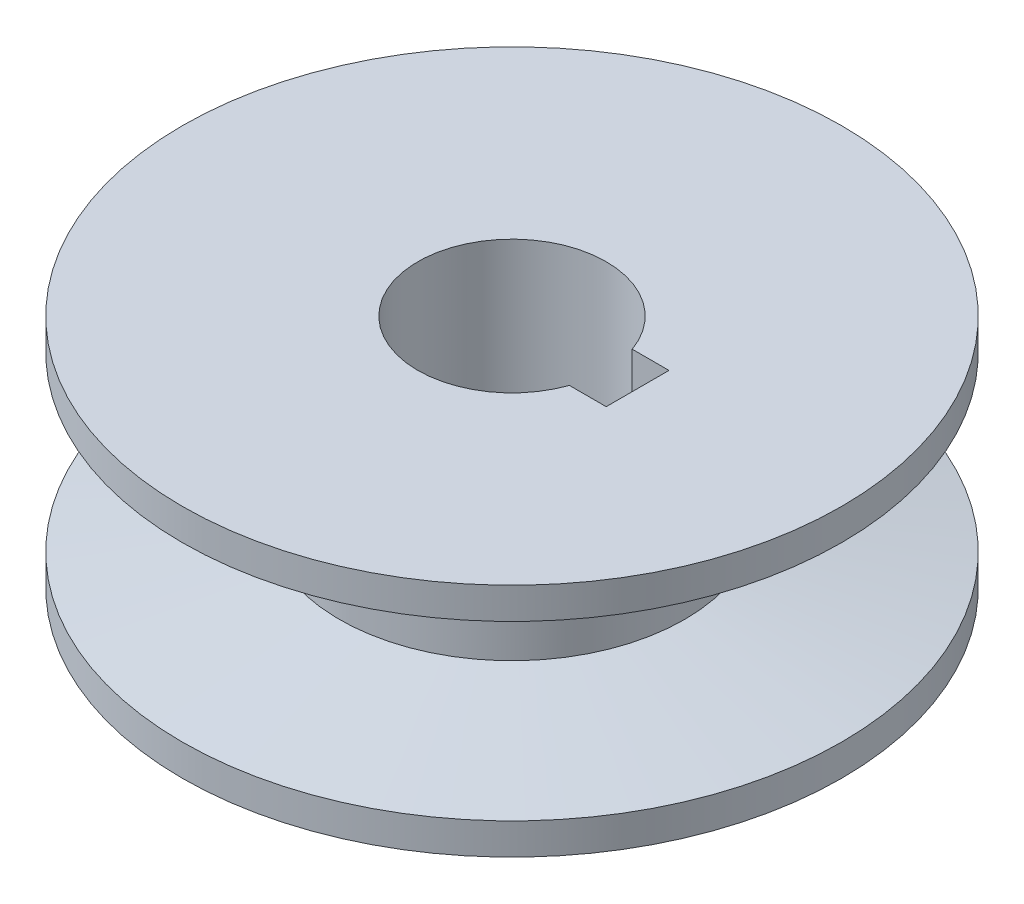
ISO-10303-21;
HEADER;
FILE_DESCRIPTION(('STEP AP214'),'2;1');
FILE_NAME('part.step','',(''),(''),'','','');
FILE_SCHEMA(('AUTOMOTIVE_DESIGN { 1 0 10303 214 1 1 1 1 }'));
ENDSEC;
DATA;
#1=APPLICATION_CONTEXT('core data for automotive mechanical design processes');
#2=APPLICATION_PROTOCOL_DEFINITION('international standard','automotive_design',2000,#1);
#3=PRODUCT_CONTEXT('',#1,'mechanical');
#4=PRODUCT('Part','Part','',(#3));
#5=PRODUCT_RELATED_PRODUCT_CATEGORY('part','',(#4));
#6=PRODUCT_DEFINITION_FORMATION('','',#4);
#7=PRODUCT_DEFINITION_CONTEXT('part definition',#1,'design');
#8=PRODUCT_DEFINITION('design','',#6,#7);
#9=PRODUCT_DEFINITION_SHAPE('','',#8);
#10=(LENGTH_UNIT() NAMED_UNIT(*) SI_UNIT(.MILLI.,.METRE.));
#11=(NAMED_UNIT(*) PLANE_ANGLE_UNIT() SI_UNIT($,.RADIAN.));
#12=(NAMED_UNIT(*) SI_UNIT($,.STERADIAN.) SOLID_ANGLE_UNIT());
#13=UNCERTAINTY_MEASURE_WITH_UNIT(LENGTH_MEASURE(1.E-05),#10,'distance_accuracy_value','');
#14=(GEOMETRIC_REPRESENTATION_CONTEXT(3) GLOBAL_UNCERTAINTY_ASSIGNED_CONTEXT((#13)) GLOBAL_UNIT_ASSIGNED_CONTEXT((#10,
#11,#12)) REPRESENTATION_CONTEXT('',''));
#15=CARTESIAN_POINT('',(0.,0.,0.));
#16=DIRECTION('',(0.,0.,1.));
#17=DIRECTION('',(1.,0.,0.));
#18=AXIS2_PLACEMENT_3D('',#15,#16,#17);
#19=CARTESIAN_POINT('',(0.,-1000.35675456204,0.));
#20=DIRECTION('',(0.,-1.,0.));
#21=DIRECTION('',(1.,0.,0.));
#22=AXIS2_PLACEMENT_3D('',#19,#20,#21);
#23=CYLINDRICAL_SURFACE('',#22,6.00000000000018);
#24=DIRECTION('',(0.,-1.,0.));
#25=VECTOR('',#24,1.);
#26=CARTESIAN_POINT('',(5.65685424949258,-1000.35675456204,-2.));
#27=LINE('',#26,#25);
#28=CARTESIAN_POINT('',(5.65685424949239,7.5,-2.));
#29=VERTEX_POINT('',#28);
#30=CARTESIAN_POINT('',(5.65685424949239,-7.5,-2.));
#31=VERTEX_POINT('',#30);
#32=EDGE_CURVE('E118',#29,#31,#27,.T.);
#33=ORIENTED_EDGE('',*,*,#32,.F.);
#34=CARTESIAN_POINT('',(-1.8515006871146E-13,7.50000000000006,0.));
#35=DIRECTION('',(0.,-1.,0.));
#36=DIRECTION('',(1.,0.,0.));
#37=AXIS2_PLACEMENT_3D('',#34,#35,#36);
#38=CIRCLE('',#37,6.00000000000018);
#39=CARTESIAN_POINT('',(5.65685424949239,7.5,2.));
#40=VERTEX_POINT('',#39);
#41=EDGE_CURVE('E49',#40,#29,#38,.T.);
#42=ORIENTED_EDGE('',*,*,#41,.F.);
#43=DIRECTION('',(0.,-1.,0.));
#44=VECTOR('',#43,1.);
#45=CARTESIAN_POINT('',(5.65685424949258,-1000.35675456204,2.));
#46=LINE('',#45,#44);
#47=CARTESIAN_POINT('',(5.65685424949239,-7.5,2.));
#48=VERTEX_POINT('',#47);
#49=EDGE_CURVE('E87',#48,#40,#46,.F.);
#50=ORIENTED_EDGE('',*,*,#49,.F.);
#51=CARTESIAN_POINT('',(-1.82394467761126E-13,-7.49999999999995,0.));
#52=DIRECTION('',(0.,-1.,0.));
#53=DIRECTION('',(1.,0.,0.));
#54=AXIS2_PLACEMENT_3D('',#51,#52,#53);
#55=CIRCLE('',#54,6.00000000000018);
#56=EDGE_CURVE('E121',#48,#31,#55,.T.);
#57=ORIENTED_EDGE('',*,*,#56,.T.);
#58=EDGE_LOOP('',(#33,#42,#50,#57));
#59=FACE_BOUND('',#58,.T.);
#60=ADVANCED_FACE('F41',(#59),#23,.F.);
#61=CARTESIAN_POINT('',(6.,7.5,0.));
#62=DIRECTION('',(0.,1.,0.));
#63=DIRECTION('',(-1.,0.,0.));
#64=AXIS2_PLACEMENT_3D('',#61,#62,#63);
#65=PLANE('',#64);
#66=DIRECTION('',(-1.,0.,0.));
#67=VECTOR('',#66,1.);
#68=CARTESIAN_POINT('',(8.,7.5,-2.));
#69=LINE('',#68,#67);
#70=CARTESIAN_POINT('',(8.,7.5,-2.));
#71=VERTEX_POINT('',#70);
#72=EDGE_CURVE('E63',#71,#29,#69,.T.);
#73=ORIENTED_EDGE('',*,*,#72,.F.);
#74=DIRECTION('',(0.,0.,-1.));
#75=VECTOR('',#74,1.);
#76=CARTESIAN_POINT('',(8.,7.5,-2.));
#77=LINE('',#76,#75);
#78=CARTESIAN_POINT('',(8.,7.5,2.));
#79=VERTEX_POINT('',#78);
#80=EDGE_CURVE('E96',#79,#71,#77,.T.);
#81=ORIENTED_EDGE('',*,*,#80,.F.);
#82=DIRECTION('',(1.,0.,0.));
#83=VECTOR('',#82,1.);
#84=CARTESIAN_POINT('',(8.,7.5,2.));
#85=LINE('',#84,#83);
#86=EDGE_CURVE('E81',#40,#79,#85,.T.);
#87=ORIENTED_EDGE('',*,*,#86,.F.);
#88=ORIENTED_EDGE('',*,*,#41,.T.);
#89=EDGE_LOOP('',(#73,#81,#87,#88));
#90=FACE_BOUND('',#89,.T.);
#91=CARTESIAN_POINT('',(-1.8515006871146E-13,7.50000000000006,0.));
#92=DIRECTION('',(0.,-1.,0.));
#93=DIRECTION('',(1.,0.,0.));
#94=AXIS2_PLACEMENT_3D('',#91,#92,#93);
#95=CIRCLE('',#94,21.0000000000002);
#96=CARTESIAN_POINT('',(21.,7.50000000000007,0.));
#97=VERTEX_POINT('',#96);
#98=EDGE_CURVE('E145',#97,#97,#95,.T.);
#99=ORIENTED_EDGE('',*,*,#98,.F.);
#100=EDGE_LOOP('',(#99));
#101=FACE_BOUND('',#100,.T.);
#102=ADVANCED_FACE('F101',(#90,#101),#65,.T.);
#103=CARTESIAN_POINT('',(0.,-1000.35675456204,0.));
#104=DIRECTION('',(0.,-1.,0.));
#105=DIRECTION('',(1.,0.,0.));
#106=AXIS2_PLACEMENT_3D('',#103,#104,#105);
#107=CYLINDRICAL_SURFACE('',#106,21.0000000000002);
#108=ORIENTED_EDGE('',*,*,#98,.T.);
#109=EDGE_LOOP('',(#108));
#110=FACE_BOUND('',#109,.T.);
#111=CARTESIAN_POINT('',(-1.84782655251416E-13,5.50000000000006,0.));
#112=DIRECTION('',(0.,-1.,0.));
#113=DIRECTION('',(1.,0.,0.));
#114=AXIS2_PLACEMENT_3D('',#111,#112,#113);
#115=CIRCLE('',#114,21.0000000000002);
#116=CARTESIAN_POINT('',(21.,5.50000000000006,0.));
#117=VERTEX_POINT('',#116);
#118=EDGE_CURVE('E141',#117,#117,#115,.T.);
#119=ORIENTED_EDGE('',*,*,#118,.F.);
#120=EDGE_LOOP('',(#119));
#121=FACE_BOUND('',#120,.T.);
#122=ADVANCED_FACE('F175',(#110,#121),#107,.T.);
#123=CARTESIAN_POINT('',(-1.84458730721009E-13,3.73673019291521,0.));
#124=DIRECTION('',(0.,1.,0.));
#125=DIRECTION('',(-1.,0.,0.));
#126=AXIS2_PLACEMENT_3D('',#123,#124,#125);
#127=CONICAL_SURFACE('',#126,11.0000000000002,1.39626340159544);
#128=ORIENTED_EDGE('',*,*,#118,.T.);
#129=EDGE_LOOP('',(#128));
#130=FACE_BOUND('',#129,.T.);
#131=CARTESIAN_POINT('',(-1.84458730721009E-13,3.73673019291521,0.));
#132=DIRECTION('',(0.,-1.,0.));
#133=DIRECTION('',(1.,0.,0.));
#134=AXIS2_PLACEMENT_3D('',#131,#132,#133);
#135=CIRCLE('',#134,11.0000000000002);
#136=CARTESIAN_POINT('',(11.,3.73673019291521,0.));
#137=VERTEX_POINT('',#136);
#138=EDGE_CURVE('E137',#137,#137,#135,.T.);
#139=ORIENTED_EDGE('',*,*,#138,.F.);
#140=EDGE_LOOP('',(#139));
#141=FACE_BOUND('',#140,.T.);
#142=ADVANCED_FACE('F179',(#130,#141),#127,.T.);
#143=CARTESIAN_POINT('',(0.,-1000.35675456204,0.));
#144=DIRECTION('',(0.,-1.,0.));
#145=DIRECTION('',(1.,0.,0.));
#146=AXIS2_PLACEMENT_3D('',#143,#144,#145);
#147=CYLINDRICAL_SURFACE('',#146,11.0000000000002);
#148=ORIENTED_EDGE('',*,*,#138,.T.);
#149=EDGE_LOOP('',(#148));
#150=FACE_BOUND('',#149,.T.);
#151=CARTESIAN_POINT('',(-1.83085805751577E-13,-3.73673019291532,0.));
#152=DIRECTION('',(0.,-1.,0.));
#153=DIRECTION('',(1.,0.,0.));
#154=AXIS2_PLACEMENT_3D('',#151,#152,#153);
#155=CIRCLE('',#154,11.0000000000002);
#156=CARTESIAN_POINT('',(11.,-3.73673019291531,0.));
#157=VERTEX_POINT('',#156);
#158=EDGE_CURVE('E133',#157,#157,#155,.T.);
#159=ORIENTED_EDGE('',*,*,#158,.F.);
#160=EDGE_LOOP('',(#159));
#161=FACE_BOUND('',#160,.T.);
#162=ADVANCED_FACE('F168',(#150,#161),#147,.T.);
#163=CARTESIAN_POINT('',(-1.8276188122117E-13,-5.49999999999995,0.));
#164=DIRECTION('',(0.,-1.,0.));
#165=DIRECTION('',(1.,0.,0.));
#166=AXIS2_PLACEMENT_3D('',#163,#164,#165);
#167=CONICAL_SURFACE('',#166,21.0000000000002,1.39626340159547);
#168=ORIENTED_EDGE('',*,*,#158,.T.);
#169=EDGE_LOOP('',(#168));
#170=FACE_BOUND('',#169,.T.);
#171=CARTESIAN_POINT('',(-1.8276188122117E-13,-5.49999999999995,0.));
#172=DIRECTION('',(0.,-1.,0.));
#173=DIRECTION('',(1.,0.,0.));
#174=AXIS2_PLACEMENT_3D('',#171,#172,#173);
#175=CIRCLE('',#174,21.0000000000002);
#176=CARTESIAN_POINT('',(21.,-5.49999999999995,0.));
#177=VERTEX_POINT('',#176);
#178=EDGE_CURVE('E129',#177,#177,#175,.T.);
#179=ORIENTED_EDGE('',*,*,#178,.F.);
#180=EDGE_LOOP('',(#179));
#181=FACE_BOUND('',#180,.T.);
#182=ADVANCED_FACE('F162',(#170,#181),#167,.T.);
#183=CARTESIAN_POINT('',(0.,-1000.35675456204,0.));
#184=DIRECTION('',(0.,-1.,0.));
#185=DIRECTION('',(1.,0.,0.));
#186=AXIS2_PLACEMENT_3D('',#183,#184,#185);
#187=CYLINDRICAL_SURFACE('',#186,21.0000000000002);
#188=ORIENTED_EDGE('',*,*,#178,.T.);
#189=EDGE_LOOP('',(#188));
#190=FACE_BOUND('',#189,.T.);
#191=CARTESIAN_POINT('',(-1.82394467761126E-13,-7.49999999999995,0.));
#192=DIRECTION('',(0.,-1.,0.));
#193=DIRECTION('',(1.,0.,0.));
#194=AXIS2_PLACEMENT_3D('',#191,#192,#193);
#195=CIRCLE('',#194,21.0000000000002);
#196=CARTESIAN_POINT('',(21.,-7.49999999999995,0.));
#197=VERTEX_POINT('',#196);
#198=EDGE_CURVE('E125',#197,#197,#195,.T.);
#199=ORIENTED_EDGE('',*,*,#198,.F.);
#200=EDGE_LOOP('',(#199));
#201=FACE_BOUND('',#200,.T.);
#202=ADVANCED_FACE('F157',(#190,#201),#187,.T.);
#203=CARTESIAN_POINT('',(6.,-7.5,0.));
#204=DIRECTION('',(0.,-1.,0.));
#205=DIRECTION('',(1.,0.,0.));
#206=AXIS2_PLACEMENT_3D('',#203,#204,#205);
#207=PLANE('',#206);
#208=DIRECTION('',(-1.,0.,0.));
#209=VECTOR('',#208,1.);
#210=CARTESIAN_POINT('',(8.,-7.5,-2.));
#211=LINE('',#210,#209);
#212=CARTESIAN_POINT('',(8.,-7.5,-2.));
#213=VERTEX_POINT('',#212);
#214=EDGE_CURVE('E93',#213,#31,#211,.T.);
#215=ORIENTED_EDGE('',*,*,#214,.T.);
#216=ORIENTED_EDGE('',*,*,#56,.F.);
#217=DIRECTION('',(-1.,0.,0.));
#218=VECTOR('',#217,1.);
#219=CARTESIAN_POINT('',(6.,-7.5,2.));
#220=LINE('',#219,#218);
#221=CARTESIAN_POINT('',(8.,-7.5,2.));
#222=VERTEX_POINT('',#221);
#223=EDGE_CURVE('E11',#222,#48,#220,.T.);
#224=ORIENTED_EDGE('',*,*,#223,.F.);
#225=DIRECTION('',(0.,0.,-1.));
#226=VECTOR('',#225,1.);
#227=CARTESIAN_POINT('',(8.,-7.5,-2.));
#228=LINE('',#227,#226);
#229=EDGE_CURVE('E98',#222,#213,#228,.T.);
#230=ORIENTED_EDGE('',*,*,#229,.T.);
#231=EDGE_LOOP('',(#215,#216,#224,#230));
#232=FACE_BOUND('',#231,.T.);
#233=ORIENTED_EDGE('',*,*,#198,.T.);
#234=EDGE_LOOP('',(#233));
#235=FACE_BOUND('',#234,.T.);
#236=ADVANCED_FACE('F154',(#232,#235),#207,.T.);
#237=CARTESIAN_POINT('',(8.,-16.4442719099992,-2.));
#238=DIRECTION('',(0.,0.,-1.));
#239=DIRECTION('',(-1.,0.,0.));
#240=AXIS2_PLACEMENT_3D('',#237,#238,#239);
#241=PLANE('',#240);
#242=ORIENTED_EDGE('',*,*,#32,.T.);
#243=ORIENTED_EDGE('',*,*,#214,.F.);
#244=DIRECTION('',(0.,1.,0.));
#245=VECTOR('',#244,1.);
#246=CARTESIAN_POINT('',(8.,-16.4442719099992,-2.));
#247=LINE('',#246,#245);
#248=EDGE_CURVE('E56',#213,#71,#247,.T.);
#249=ORIENTED_EDGE('',*,*,#248,.T.);
#250=ORIENTED_EDGE('',*,*,#72,.T.);
#251=EDGE_LOOP('',(#242,#243,#249,#250));
#252=FACE_BOUND('',#251,.T.);
#253=ADVANCED_FACE('F152',(#252),#241,.F.);
#254=CARTESIAN_POINT('',(8.,-16.4442719099992,2.));
#255=DIRECTION('',(0.,0.,1.));
#256=DIRECTION('',(1.,0.,0.));
#257=AXIS2_PLACEMENT_3D('',#254,#255,#256);
#258=PLANE('',#257);
#259=ORIENTED_EDGE('',*,*,#49,.T.);
#260=ORIENTED_EDGE('',*,*,#86,.T.);
#261=DIRECTION('',(0.,1.,0.));
#262=VECTOR('',#261,1.);
#263=CARTESIAN_POINT('',(8.,-16.4442719099992,2.));
#264=LINE('',#263,#262);
#265=EDGE_CURVE('E84',#222,#79,#264,.T.);
#266=ORIENTED_EDGE('',*,*,#265,.F.);
#267=ORIENTED_EDGE('',*,*,#223,.T.);
#268=EDGE_LOOP('',(#259,#260,#266,#267));
#269=FACE_BOUND('',#268,.T.);
#270=ADVANCED_FACE('F83',(#269),#258,.F.);
#271=CARTESIAN_POINT('',(8.,-16.4442719099992,-2.));
#272=DIRECTION('',(1.,0.,0.));
#273=DIRECTION('',(0.,1.,0.));
#274=AXIS2_PLACEMENT_3D('',#271,#272,#273);
#275=PLANE('',#274);
#276=ORIENTED_EDGE('',*,*,#265,.T.);
#277=ORIENTED_EDGE('',*,*,#80,.T.);
#278=ORIENTED_EDGE('',*,*,#248,.F.);
#279=ORIENTED_EDGE('',*,*,#229,.F.);
#280=EDGE_LOOP('',(#276,#277,#278,#279));
#281=FACE_BOUND('',#280,.T.);
#282=ADVANCED_FACE('F95',(#281),#275,.F.);
#283=CLOSED_SHELL('',(#60,#102,#122,#142,#162,#182,#202,#236,#253,#270,#282));
#284=MANIFOLD_SOLID_BREP('B2',#283);
#285=ADVANCED_BREP_SHAPE_REPRESENTATION('',(#18,#284),#14);
#286=SHAPE_DEFINITION_REPRESENTATION(#9,#285);
ENDSEC;
END-ISO-10303-21;
